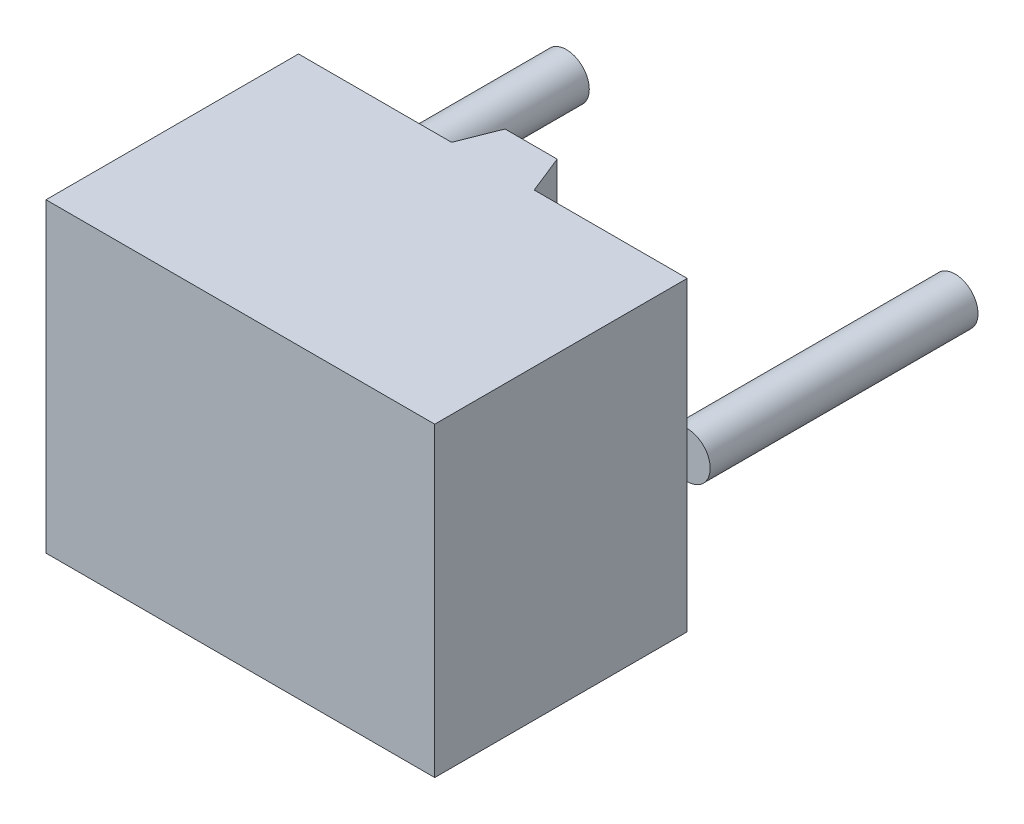
ISO-10303-21;
HEADER;
FILE_DESCRIPTION(('STEP AP214'),'2;1');
FILE_NAME('part.step','',(''),(''),'','','');
FILE_SCHEMA(('AUTOMOTIVE_DESIGN { 1 0 10303 214 1 1 1 1 }'));
ENDSEC;
DATA;
#1=APPLICATION_CONTEXT('core data for automotive mechanical design processes');
#2=APPLICATION_PROTOCOL_DEFINITION('international standard','automotive_design',2000,#1);
#3=PRODUCT_CONTEXT('',#1,'mechanical');
#4=PRODUCT('Part','Part','',(#3));
#5=PRODUCT_RELATED_PRODUCT_CATEGORY('part','',(#4));
#6=PRODUCT_DEFINITION_FORMATION('','',#4);
#7=PRODUCT_DEFINITION_CONTEXT('part definition',#1,'design');
#8=PRODUCT_DEFINITION('design','',#6,#7);
#9=PRODUCT_DEFINITION_SHAPE('','',#8);
#10=(LENGTH_UNIT() NAMED_UNIT(*) SI_UNIT(.MILLI.,.METRE.));
#11=(NAMED_UNIT(*) PLANE_ANGLE_UNIT() SI_UNIT($,.RADIAN.));
#12=(NAMED_UNIT(*) SI_UNIT($,.STERADIAN.) SOLID_ANGLE_UNIT());
#13=UNCERTAINTY_MEASURE_WITH_UNIT(LENGTH_MEASURE(1.E-05),#10,'distance_accuracy_value','');
#14=(GEOMETRIC_REPRESENTATION_CONTEXT(3) GLOBAL_UNCERTAINTY_ASSIGNED_CONTEXT((#13)) GLOBAL_UNIT_ASSIGNED_CONTEXT((#10,
#11,#12)) REPRESENTATION_CONTEXT('',''));
#15=CARTESIAN_POINT('',(0.,0.,0.));
#16=DIRECTION('',(0.,0.,1.));
#17=DIRECTION('',(1.,0.,0.));
#18=AXIS2_PLACEMENT_3D('',#15,#16,#17);
#19=CARTESIAN_POINT('',(0.,-3.6,0.5));
#20=DIRECTION('',(0.,0.,1.));
#21=DIRECTION('',(1.,0.,0.));
#22=AXIS2_PLACEMENT_3D('',#19,#20,#21);
#23=PLANE('',#22);
#24=CARTESIAN_POINT('',(0.,0.,0.5));
#25=DIRECTION('',(0.,0.,1.));
#26=DIRECTION('',(1.,0.,0.));
#27=AXIS2_PLACEMENT_3D('',#24,#25,#26);
#28=CIRCLE('',#27,0.3);
#29=CARTESIAN_POINT('',(0.,0.3,0.5));
#30=VERTEX_POINT('',#29);
#31=CARTESIAN_POINT('',(0.,-0.3,0.5));
#32=VERTEX_POINT('',#31);
#33=EDGE_CURVE('E11',#30,#32,#28,.F.);
#34=ORIENTED_EDGE('',*,*,#33,.F.);
#35=DIRECTION('',(0.,1.,0.));
#36=VECTOR('',#35,1.);
#37=CARTESIAN_POINT('',(0.,-3.6,0.5));
#38=LINE('',#37,#36);
#39=CARTESIAN_POINT('',(0.,2.,0.5));
#40=VERTEX_POINT('',#39);
#41=EDGE_CURVE('E115',#30,#40,#38,.T.);
#42=ORIENTED_EDGE('',*,*,#41,.T.);
#43=DIRECTION('',(1.,0.,0.));
#44=VECTOR('',#43,1.);
#45=CARTESIAN_POINT('',(0.,2.,0.5));
#46=LINE('',#45,#44);
#47=CARTESIAN_POINT('',(2.,2.00000000000001,0.5));
#48=VERTEX_POINT('',#47);
#49=EDGE_CURVE('E145',#40,#48,#46,.T.);
#50=ORIENTED_EDGE('',*,*,#49,.T.);
#51=DIRECTION('',(0.,1.,0.));
#52=VECTOR('',#51,1.);
#53=CARTESIAN_POINT('',(2.00000000000003,-3.59999999999999,0.5));
#54=LINE('',#53,#52);
#55=CARTESIAN_POINT('',(2.00000000000002,-2.,0.5));
#56=VERTEX_POINT('',#55);
#57=EDGE_CURVE('E112',#56,#48,#54,.T.);
#58=ORIENTED_EDGE('',*,*,#57,.F.);
#59=DIRECTION('',(1.,0.,0.));
#60=VECTOR('',#59,1.);
#61=CARTESIAN_POINT('',(2.54,-2.,0.5));
#62=LINE('',#61,#60);
#63=CARTESIAN_POINT('',(0.,-2.,0.5));
#64=VERTEX_POINT('',#63);
#65=EDGE_CURVE('E108',#64,#56,#62,.T.);
#66=ORIENTED_EDGE('',*,*,#65,.F.);
#67=EDGE_CURVE('E104',#64,#32,#38,.T.);
#68=ORIENTED_EDGE('',*,*,#67,.T.);
#69=EDGE_LOOP('',(#34,#42,#50,#58,#66,#68));
#70=FACE_BOUND('',#69,.T.);
#71=ADVANCED_FACE('F30',(#70),#23,.F.);
#72=CARTESIAN_POINT('',(5.08000000000003,-3.59999999999998,0.5));
#73=DIRECTION('',(0.,0.,1.));
#74=DIRECTION('',(1.,0.,0.));
#75=AXIS2_PLACEMENT_3D('',#72,#73,#74);
#76=PLANE('',#75);
#77=CARTESIAN_POINT('',(5.08,0.,0.5));
#78=DIRECTION('',(0.,0.,1.));
#79=DIRECTION('',(1.,0.,0.));
#80=AXIS2_PLACEMENT_3D('',#77,#78,#79);
#81=CIRCLE('',#80,0.3);
#82=CARTESIAN_POINT('',(5.08,-0.299999999999998,0.5));
#83=VERTEX_POINT('',#82);
#84=CARTESIAN_POINT('',(5.08000000000001,0.300000000000002,0.5));
#85=VERTEX_POINT('',#84);
#86=EDGE_CURVE('E186',#83,#85,#81,.T.);
#87=ORIENTED_EDGE('',*,*,#86,.T.);
#88=DIRECTION('',(0.,-1.,0.));
#89=VECTOR('',#88,1.);
#90=CARTESIAN_POINT('',(5.08,-3.59999999999998,0.5));
#91=LINE('',#90,#89);
#92=EDGE_CURVE('E38',#85,#83,#91,.T.);
#93=ORIENTED_EDGE('',*,*,#92,.T.);
#94=EDGE_LOOP('',(#87,#93));
#95=FACE_BOUND('',#94,.T.);
#96=ADVANCED_FACE('F195',(#95),#76,.T.);
#97=CARTESIAN_POINT('',(5.08,0.,-3.));
#98=DIRECTION('',(0.,0.,1.));
#99=DIRECTION('',(1.,0.,0.));
#100=AXIS2_PLACEMENT_3D('',#97,#98,#99);
#101=CYLINDRICAL_SURFACE('',#100,0.3);
#102=CARTESIAN_POINT('',(5.08,0.,-3.));
#103=DIRECTION('',(0.,0.,1.));
#104=DIRECTION('',(-1.,0.,0.));
#105=AXIS2_PLACEMENT_3D('',#102,#103,#104);
#106=CIRCLE('',#105,0.3);
#107=CARTESIAN_POINT('',(4.78,0.,-3.));
#108=VERTEX_POINT('',#107);
#109=EDGE_CURVE('E189',#108,#108,#106,.T.);
#110=ORIENTED_EDGE('',*,*,#109,.T.);
#111=EDGE_LOOP('',(#110));
#112=FACE_BOUND('',#111,.T.);
#113=EDGE_CURVE('E187',#85,#83,#81,.T.);
#114=ORIENTED_EDGE('',*,*,#113,.F.);
#115=ORIENTED_EDGE('',*,*,#86,.F.);
#116=EDGE_LOOP('',(#114,#115));
#117=FACE_BOUND('',#116,.T.);
#118=ADVANCED_FACE('F32',(#112,#117),#101,.T.);
#119=CARTESIAN_POINT('',(5.08,0.,-3.));
#120=DIRECTION('',(0.,0.,-1.));
#121=DIRECTION('',(-1.,0.,0.));
#122=AXIS2_PLACEMENT_3D('',#119,#120,#121);
#123=PLANE('',#122);
#124=ORIENTED_EDGE('',*,*,#109,.F.);
#125=EDGE_LOOP('',(#124));
#126=FACE_BOUND('',#125,.T.);
#127=ADVANCED_FACE('F253',(#126),#123,.T.);
#128=CARTESIAN_POINT('',(5.08,0.,3.8));
#129=DIRECTION('',(-1.,0.,0.));
#130=DIRECTION('',(0.,0.,1.));
#131=AXIS2_PLACEMENT_3D('',#128,#129,#130);
#132=PLANE('',#131);
#133=DIRECTION('',(0.,0.,-1.));
#134=VECTOR('',#133,1.);
#135=CARTESIAN_POINT('',(5.08,-2.,3.8));
#136=LINE('',#135,#134);
#137=CARTESIAN_POINT('',(5.08,-2.,3.8));
#138=VERTEX_POINT('',#137);
#139=CARTESIAN_POINT('',(5.08000000000002,-2.,0.5));
#140=VERTEX_POINT('',#139);
#141=EDGE_CURVE('E176',#138,#140,#136,.T.);
#142=ORIENTED_EDGE('',*,*,#141,.T.);
#143=DIRECTION('',(0.,1.,0.));
#144=VECTOR('',#143,1.);
#145=CARTESIAN_POINT('',(5.08000000000003,-3.59999999999998,0.5));
#146=LINE('',#145,#144);
#147=EDGE_CURVE('E51',#140,#83,#146,.T.);
#148=ORIENTED_EDGE('',*,*,#147,.T.);
#149=ORIENTED_EDGE('',*,*,#92,.F.);
#150=CARTESIAN_POINT('',(5.08,2.00000000000002,0.5));
#151=VERTEX_POINT('',#150);
#152=EDGE_CURVE('E141',#85,#151,#146,.T.);
#153=ORIENTED_EDGE('',*,*,#152,.T.);
#154=DIRECTION('',(0.,0.,-1.));
#155=VECTOR('',#154,1.);
#156=CARTESIAN_POINT('',(5.08,2.,3.8));
#157=LINE('',#156,#155);
#158=CARTESIAN_POINT('',(5.08,2.,3.8));
#159=VERTEX_POINT('',#158);
#160=EDGE_CURVE('E173',#159,#151,#157,.T.);
#161=ORIENTED_EDGE('',*,*,#160,.F.);
#162=DIRECTION('',(0.,1.,0.));
#163=VECTOR('',#162,1.);
#164=CARTESIAN_POINT('',(5.08,-2.,3.8));
#165=LINE('',#164,#163);
#166=EDGE_CURVE('E159',#138,#159,#165,.T.);
#167=ORIENTED_EDGE('',*,*,#166,.F.);
#168=EDGE_LOOP('',(#142,#148,#149,#153,#161,#167));
#169=FACE_BOUND('',#168,.T.);
#170=ADVANCED_FACE('F202',(#169),#132,.F.);
#171=CARTESIAN_POINT('',(2.54,2.,3.8));
#172=DIRECTION('',(0.,-1.,0.));
#173=DIRECTION('',(1.,0.,0.));
#174=AXIS2_PLACEMENT_3D('',#171,#172,#173);
#175=PLANE('',#174);
#176=DIRECTION('',(1.,0.,0.));
#177=VECTOR('',#176,1.);
#178=CARTESIAN_POINT('',(5.08,2.00000000000002,0.5));
#179=LINE('',#178,#177);
#180=CARTESIAN_POINT('',(3.08,2.00000000000001,0.5));
#181=VERTEX_POINT('',#180);
#182=EDGE_CURVE('E131',#181,#151,#179,.T.);
#183=ORIENTED_EDGE('',*,*,#182,.F.);
#184=DIRECTION('',(0.371390676354104,0.,0.928476690885259));
#185=VECTOR('',#184,1.);
#186=CARTESIAN_POINT('',(3.08,2.00000000000001,0.5));
#187=LINE('',#186,#185);
#188=CARTESIAN_POINT('',(2.88,2.00000000000001,0.));
#189=VERTEX_POINT('',#188);
#190=EDGE_CURVE('E127',#189,#181,#187,.T.);
#191=ORIENTED_EDGE('',*,*,#190,.F.);
#192=DIRECTION('',(-1.,0.,0.));
#193=VECTOR('',#192,1.);
#194=CARTESIAN_POINT('',(2.54,2.,0.));
#195=LINE('',#194,#193);
#196=CARTESIAN_POINT('',(2.2,2.,0.));
#197=VERTEX_POINT('',#196);
#198=EDGE_CURVE('E155',#189,#197,#195,.T.);
#199=ORIENTED_EDGE('',*,*,#198,.T.);
#200=DIRECTION('',(0.371390676354104,0.,-0.928476690885259));
#201=VECTOR('',#200,1.);
#202=CARTESIAN_POINT('',(2.,2.00000000000001,0.5));
#203=LINE('',#202,#201);
#204=EDGE_CURVE('E148',#48,#197,#203,.T.);
#205=ORIENTED_EDGE('',*,*,#204,.F.);
#206=ORIENTED_EDGE('',*,*,#49,.F.);
#207=DIRECTION('',(0.,0.,-1.));
#208=VECTOR('',#207,1.);
#209=CARTESIAN_POINT('',(0.,2.,3.8));
#210=LINE('',#209,#208);
#211=CARTESIAN_POINT('',(0.,2.,3.8));
#212=VERTEX_POINT('',#211);
#213=EDGE_CURVE('E171',#212,#40,#210,.T.);
#214=ORIENTED_EDGE('',*,*,#213,.F.);
#215=DIRECTION('',(-1.,0.,0.));
#216=VECTOR('',#215,1.);
#217=CARTESIAN_POINT('',(5.08,2.,3.8));
#218=LINE('',#217,#216);
#219=EDGE_CURVE('E162',#159,#212,#218,.T.);
#220=ORIENTED_EDGE('',*,*,#219,.F.);
#221=ORIENTED_EDGE('',*,*,#160,.T.);
#222=EDGE_LOOP('',(#183,#191,#199,#205,#206,#214,#220,#221));
#223=FACE_BOUND('',#222,.T.);
#224=ADVANCED_FACE('F206',(#223),#175,.F.);
#225=CARTESIAN_POINT('',(0.,-2.,3.8));
#226=DIRECTION('',(1.,0.,0.));
#227=DIRECTION('',(0.,0.,-1.));
#228=AXIS2_PLACEMENT_3D('',#225,#226,#227);
#229=PLANE('',#228);
#230=ORIENTED_EDGE('',*,*,#213,.T.);
#231=ORIENTED_EDGE('',*,*,#41,.F.);
#232=EDGE_CURVE('E113',#32,#30,#38,.T.);
#233=ORIENTED_EDGE('',*,*,#232,.F.);
#234=ORIENTED_EDGE('',*,*,#67,.F.);
#235=DIRECTION('',(0.,0.,-1.));
#236=VECTOR('',#235,1.);
#237=CARTESIAN_POINT('',(0.,-2.,3.8));
#238=LINE('',#237,#236);
#239=CARTESIAN_POINT('',(0.,-2.,3.8));
#240=VERTEX_POINT('',#239);
#241=EDGE_CURVE('E166',#240,#64,#238,.T.);
#242=ORIENTED_EDGE('',*,*,#241,.F.);
#243=DIRECTION('',(0.,-1.,0.));
#244=VECTOR('',#243,1.);
#245=CARTESIAN_POINT('',(0.,0.,3.8));
#246=LINE('',#245,#244);
#247=EDGE_CURVE('E164',#212,#240,#246,.T.);
#248=ORIENTED_EDGE('',*,*,#247,.F.);
#249=EDGE_LOOP('',(#230,#231,#233,#234,#242,#248));
#250=FACE_BOUND('',#249,.T.);
#251=ADVANCED_FACE('F118',(#250),#229,.F.);
#252=CARTESIAN_POINT('',(2.54,-2.,3.8));
#253=DIRECTION('',(0.,1.,0.));
#254=DIRECTION('',(-1.,0.,0.));
#255=AXIS2_PLACEMENT_3D('',#252,#253,#254);
#256=PLANE('',#255);
#257=DIRECTION('',(1.,0.,0.));
#258=VECTOR('',#257,1.);
#259=CARTESIAN_POINT('',(2.54,-2.,0.));
#260=LINE('',#259,#258);
#261=CARTESIAN_POINT('',(2.20000000000002,-2.,0.));
#262=VERTEX_POINT('',#261);
#263=CARTESIAN_POINT('',(2.88000000000001,-2.,0.));
#264=VERTEX_POINT('',#263);
#265=EDGE_CURVE('E160',#262,#264,#260,.T.);
#266=ORIENTED_EDGE('',*,*,#265,.T.);
#267=DIRECTION('',(0.371390676354104,0.,0.928476690885259));
#268=VECTOR('',#267,1.);
#269=CARTESIAN_POINT('',(4.14344827586208,-2.,3.15862068965517));
#270=LINE('',#269,#268);
#271=CARTESIAN_POINT('',(3.08000000000002,-2.,0.5));
#272=VERTEX_POINT('',#271);
#273=EDGE_CURVE('E140',#264,#272,#270,.T.);
#274=ORIENTED_EDGE('',*,*,#273,.T.);
#275=DIRECTION('',(1.,0.,0.));
#276=VECTOR('',#275,1.);
#277=CARTESIAN_POINT('',(2.54,-2.,0.5));
#278=LINE('',#277,#276);
#279=EDGE_CURVE('E183',#272,#140,#278,.T.);
#280=ORIENTED_EDGE('',*,*,#279,.T.);
#281=ORIENTED_EDGE('',*,*,#141,.F.);
#282=DIRECTION('',(1.,0.,0.));
#283=VECTOR('',#282,1.);
#284=CARTESIAN_POINT('',(5.08,-2.,3.8));
#285=LINE('',#284,#283);
#286=EDGE_CURVE('E156',#240,#138,#285,.T.);
#287=ORIENTED_EDGE('',*,*,#286,.F.);
#288=ORIENTED_EDGE('',*,*,#241,.T.);
#289=ORIENTED_EDGE('',*,*,#65,.T.);
#290=DIRECTION('',(0.371390676354104,0.,-0.928476690885259));
#291=VECTOR('',#290,1.);
#292=CARTESIAN_POINT('',(0.936551724137946,-2.,3.15862068965518));
#293=LINE('',#292,#291);
#294=EDGE_CURVE('E151',#56,#262,#293,.T.);
#295=ORIENTED_EDGE('',*,*,#294,.T.);
#296=EDGE_LOOP('',(#266,#274,#280,#281,#287,#288,#289,#295));
#297=FACE_BOUND('',#296,.T.);
#298=ADVANCED_FACE('F214',(#297),#256,.F.);
#299=CARTESIAN_POINT('',(0.,-2.,3.8));
#300=DIRECTION('',(0.,0.,-1.));
#301=DIRECTION('',(-1.,0.,0.));
#302=AXIS2_PLACEMENT_3D('',#299,#300,#301);
#303=PLANE('',#302);
#304=ORIENTED_EDGE('',*,*,#286,.T.);
#305=ORIENTED_EDGE('',*,*,#166,.T.);
#306=ORIENTED_EDGE('',*,*,#219,.T.);
#307=ORIENTED_EDGE('',*,*,#247,.T.);
#308=EDGE_LOOP('',(#304,#305,#306,#307));
#309=FACE_BOUND('',#308,.T.);
#310=ADVANCED_FACE('F210',(#309),#303,.F.);
#311=CARTESIAN_POINT('',(0.,-2.,0.));
#312=DIRECTION('',(0.,0.,-1.));
#313=DIRECTION('',(-1.,0.,0.));
#314=AXIS2_PLACEMENT_3D('',#311,#312,#313);
#315=PLANE('',#314);
#316=DIRECTION('',(0.,1.,0.));
#317=VECTOR('',#316,1.);
#318=CARTESIAN_POINT('',(2.88000000000002,-1.99999999999999,0.));
#319=LINE('',#318,#317);
#320=EDGE_CURVE('E181',#264,#189,#319,.T.);
#321=ORIENTED_EDGE('',*,*,#320,.F.);
#322=ORIENTED_EDGE('',*,*,#265,.F.);
#323=DIRECTION('',(0.,-1.,0.));
#324=VECTOR('',#323,1.);
#325=CARTESIAN_POINT('',(2.20000000000002,-1.99999999999999,0.));
#326=LINE('',#325,#324);
#327=EDGE_CURVE('E178',#197,#262,#326,.T.);
#328=ORIENTED_EDGE('',*,*,#327,.F.);
#329=ORIENTED_EDGE('',*,*,#198,.F.);
#330=EDGE_LOOP('',(#321,#322,#328,#329));
#331=FACE_BOUND('',#330,.T.);
#332=ADVANCED_FACE('F224',(#331),#315,.T.);
#333=CARTESIAN_POINT('',(2.00000000000003,-3.59999999999999,0.5));
#334=DIRECTION('',(0.928476690885259,0.,0.371390676354104));
#335=DIRECTION('',(0.371390676354104,0.,-0.928476690885259));
#336=AXIS2_PLACEMENT_3D('',#333,#334,#335);
#337=PLANE('',#336);
#338=ORIENTED_EDGE('',*,*,#57,.T.);
#339=ORIENTED_EDGE('',*,*,#204,.T.);
#340=ORIENTED_EDGE('',*,*,#327,.T.);
#341=ORIENTED_EDGE('',*,*,#294,.F.);
#342=EDGE_LOOP('',(#338,#339,#340,#341));
#343=FACE_BOUND('',#342,.T.);
#344=ADVANCED_FACE('F227',(#343),#337,.F.);
#345=CARTESIAN_POINT('',(5.08000000000003,-3.59999999999998,0.5));
#346=DIRECTION('',(0.,0.,1.));
#347=DIRECTION('',(1.,0.,0.));
#348=AXIS2_PLACEMENT_3D('',#345,#346,#347);
#349=PLANE('',#348);
#350=ORIENTED_EDGE('',*,*,#113,.T.);
#351=ORIENTED_EDGE('',*,*,#147,.F.);
#352=ORIENTED_EDGE('',*,*,#279,.F.);
#353=DIRECTION('',(0.,1.,0.));
#354=VECTOR('',#353,1.);
#355=CARTESIAN_POINT('',(3.08000000000002,-3.59999999999999,0.5));
#356=LINE('',#355,#354);
#357=EDGE_CURVE('E138',#272,#181,#356,.T.);
#358=ORIENTED_EDGE('',*,*,#357,.T.);
#359=ORIENTED_EDGE('',*,*,#182,.T.);
#360=ORIENTED_EDGE('',*,*,#152,.F.);
#361=EDGE_LOOP('',(#350,#351,#352,#358,#359,#360));
#362=FACE_BOUND('',#361,.T.);
#363=ADVANCED_FACE('F199',(#362),#349,.F.);
#364=CARTESIAN_POINT('',(3.08000000000002,-3.59999999999999,0.5));
#365=DIRECTION('',(-0.928476690885259,0.,0.371390676354104));
#366=DIRECTION('',(0.371390676354104,0.,0.928476690885259));
#367=AXIS2_PLACEMENT_3D('',#364,#365,#366);
#368=PLANE('',#367);
#369=ORIENTED_EDGE('',*,*,#320,.T.);
#370=ORIENTED_EDGE('',*,*,#190,.T.);
#371=ORIENTED_EDGE('',*,*,#357,.F.);
#372=ORIENTED_EDGE('',*,*,#273,.F.);
#373=EDGE_LOOP('',(#369,#370,#371,#372));
#374=FACE_BOUND('',#373,.T.);
#375=ADVANCED_FACE('F217',(#374),#368,.F.);
#376=CARTESIAN_POINT('',(5.08000000000003,-3.59999999999998,0.5));
#377=DIRECTION('',(0.,0.,1.));
#378=DIRECTION('',(1.,0.,0.));
#379=AXIS2_PLACEMENT_3D('',#376,#377,#378);
#380=PLANE('',#379);
#381=ORIENTED_EDGE('',*,*,#232,.T.);
#382=CARTESIAN_POINT('',(0.,0.,0.5));
#383=DIRECTION('',(0.,0.,1.));
#384=DIRECTION('',(1.,0.,0.));
#385=AXIS2_PLACEMENT_3D('',#382,#383,#384);
#386=CIRCLE('',#385,0.3);
#387=EDGE_CURVE('E125',#30,#32,#386,.T.);
#388=ORIENTED_EDGE('',*,*,#387,.T.);
#389=EDGE_LOOP('',(#381,#388));
#390=FACE_BOUND('',#389,.T.);
#391=ADVANCED_FACE('F126',(#390),#380,.T.);
#392=CARTESIAN_POINT('',(0.,0.,1.34852813742386));
#393=DIRECTION('',(0.,0.,-1.));
#394=DIRECTION('',(-1.,0.,0.));
#395=AXIS2_PLACEMENT_3D('',#392,#393,#394);
#396=CYLINDRICAL_SURFACE('',#395,0.3);
#397=ORIENTED_EDGE('',*,*,#387,.F.);
#398=ORIENTED_EDGE('',*,*,#33,.T.);
#399=EDGE_LOOP('',(#397,#398));
#400=FACE_BOUND('',#399,.T.);
#401=CARTESIAN_POINT('',(0.,0.,-3.));
#402=DIRECTION('',(0.,0.,1.));
#403=DIRECTION('',(1.,0.,0.));
#404=AXIS2_PLACEMENT_3D('',#401,#402,#403);
#405=CIRCLE('',#404,0.3);
#406=CARTESIAN_POINT('',(0.3,0.,-3.));
#407=VERTEX_POINT('',#406);
#408=EDGE_CURVE('E128',#407,#407,#405,.T.);
#409=ORIENTED_EDGE('',*,*,#408,.T.);
#410=EDGE_LOOP('',(#409));
#411=FACE_BOUND('',#410,.T.);
#412=ADVANCED_FACE('F123',(#400,#411),#396,.T.);
#413=CARTESIAN_POINT('',(0.,0.,-3.));
#414=DIRECTION('',(0.,0.,1.));
#415=DIRECTION('',(1.,0.,0.));
#416=AXIS2_PLACEMENT_3D('',#413,#414,#415);
#417=PLANE('',#416);
#418=ORIENTED_EDGE('',*,*,#408,.F.);
#419=EDGE_LOOP('',(#418));
#420=FACE_BOUND('',#419,.T.);
#421=ADVANCED_FACE('F356',(#420),#417,.F.);
#422=CLOSED_SHELL('',(#71,#96,#118,#127,#170,#224,#251,#298,#310,#332,#344,#363,#375,#391,#412,#421));
#423=MANIFOLD_SOLID_BREP('B2',#422);
#424=ADVANCED_BREP_SHAPE_REPRESENTATION('',(#18,#423),#14);
#425=SHAPE_DEFINITION_REPRESENTATION(#9,#424);
ENDSEC;
END-ISO-10303-21;
